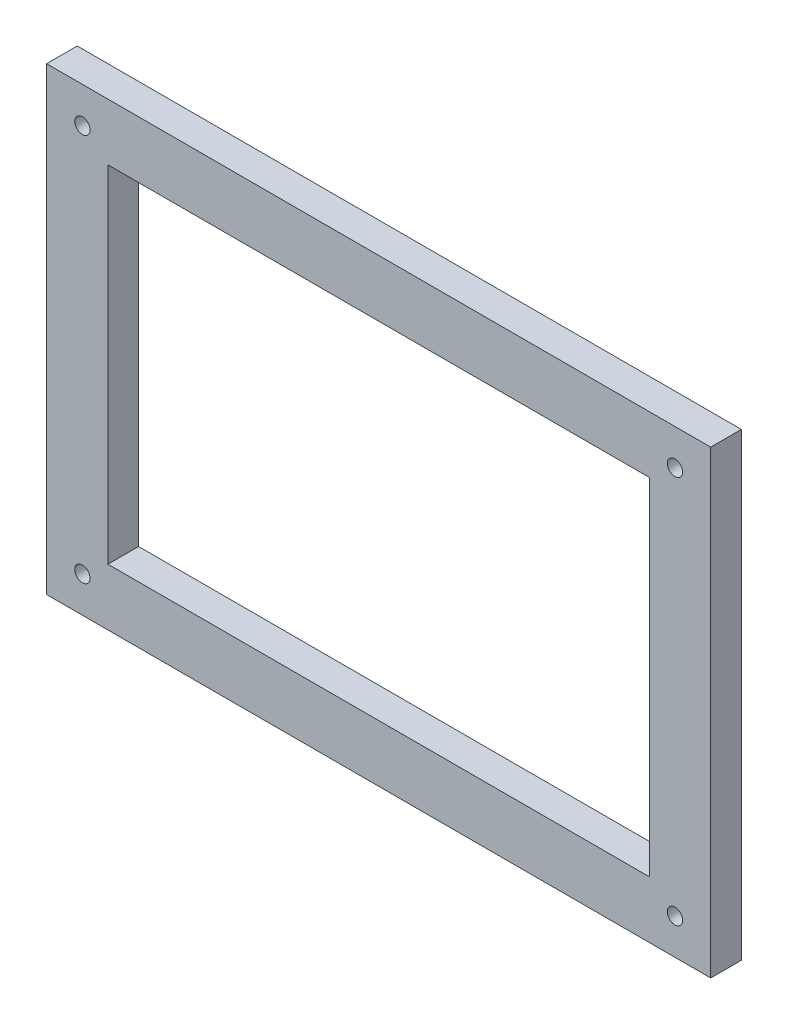
ISO-10303-21;
HEADER;
FILE_DESCRIPTION(('STEP AP214'),'2;1');
FILE_NAME('part.step','',(''),(''),'','','');
FILE_SCHEMA(('AUTOMOTIVE_DESIGN { 1 0 10303 214 1 1 1 1 }'));
ENDSEC;
DATA;
#1=APPLICATION_CONTEXT('core data for automotive mechanical design processes');
#2=APPLICATION_PROTOCOL_DEFINITION('international standard','automotive_design',2000,#1);
#3=PRODUCT_CONTEXT('',#1,'mechanical');
#4=PRODUCT('Part','Part','',(#3));
#5=PRODUCT_RELATED_PRODUCT_CATEGORY('part','',(#4));
#6=PRODUCT_DEFINITION_FORMATION('','',#4);
#7=PRODUCT_DEFINITION_CONTEXT('part definition',#1,'design');
#8=PRODUCT_DEFINITION('design','',#6,#7);
#9=PRODUCT_DEFINITION_SHAPE('','',#8);
#10=(LENGTH_UNIT() NAMED_UNIT(*) SI_UNIT(.MILLI.,.METRE.));
#11=(NAMED_UNIT(*) PLANE_ANGLE_UNIT() SI_UNIT($,.RADIAN.));
#12=(NAMED_UNIT(*) SI_UNIT($,.STERADIAN.) SOLID_ANGLE_UNIT());
#13=UNCERTAINTY_MEASURE_WITH_UNIT(LENGTH_MEASURE(1.E-05),#10,'distance_accuracy_value','');
#14=(GEOMETRIC_REPRESENTATION_CONTEXT(3) GLOBAL_UNCERTAINTY_ASSIGNED_CONTEXT((#13)) GLOBAL_UNIT_ASSIGNED_CONTEXT((#10,
#11,#12)) REPRESENTATION_CONTEXT('',''));
#15=CARTESIAN_POINT('',(0.,0.,0.));
#16=DIRECTION('',(0.,0.,1.));
#17=DIRECTION('',(1.,0.,0.));
#18=AXIS2_PLACEMENT_3D('',#15,#16,#17);
#19=CARTESIAN_POINT('',(0.,0.,6.));
#20=DIRECTION('',(0.,0.,-1.));
#21=DIRECTION('',(-1.,0.,0.));
#22=AXIS2_PLACEMENT_3D('',#19,#20,#21);
#23=PLANE('',#22);
#24=CARTESIAN_POINT('',(111.,71.85,6.));
#25=DIRECTION('',(0.,0.,1.));
#26=DIRECTION('',(1.,0.,0.));
#27=AXIS2_PLACEMENT_3D('',#24,#25,#26);
#28=CIRCLE('',#27,1.5);
#29=CARTESIAN_POINT('',(112.5,71.85,6.));
#30=VERTEX_POINT('',#29);
#31=EDGE_CURVE('E237',#30,#30,#28,.T.);
#32=ORIENTED_EDGE('',*,*,#31,.F.);
#33=EDGE_LOOP('',(#32));
#34=FACE_BOUND('',#33,.T.);
#35=CARTESIAN_POINT('',(-5.,-4.15000000000001,6.));
#36=DIRECTION('',(0.,0.,1.));
#37=DIRECTION('',(1.,0.,0.));
#38=AXIS2_PLACEMENT_3D('',#35,#36,#37);
#39=CIRCLE('',#38,1.5);
#40=CARTESIAN_POINT('',(-3.5,-4.15000000000001,6.));
#41=VERTEX_POINT('',#40);
#42=EDGE_CURVE('E250',#41,#41,#39,.T.);
#43=ORIENTED_EDGE('',*,*,#42,.F.);
#44=EDGE_LOOP('',(#43));
#45=FACE_BOUND('',#44,.T.);
#46=CARTESIAN_POINT('',(-5.,71.85,6.));
#47=DIRECTION('',(0.,0.,1.));
#48=DIRECTION('',(1.,0.,0.));
#49=AXIS2_PLACEMENT_3D('',#46,#47,#48);
#50=CIRCLE('',#49,1.5);
#51=CARTESIAN_POINT('',(-3.5,71.85,6.));
#52=VERTEX_POINT('',#51);
#53=EDGE_CURVE('E256',#52,#52,#50,.T.);
#54=ORIENTED_EDGE('',*,*,#53,.F.);
#55=EDGE_LOOP('',(#54));
#56=FACE_BOUND('',#55,.T.);
#57=DIRECTION('',(0.,-1.,0.));
#58=VECTOR('',#57,1.);
#59=CARTESIAN_POINT('',(-12.,-11.15,6.));
#60=LINE('',#59,#58);
#61=CARTESIAN_POINT('',(-12.,78.85,6.));
#62=VERTEX_POINT('',#61);
#63=CARTESIAN_POINT('',(-12.,-11.15,6.));
#64=VERTEX_POINT('',#63);
#65=EDGE_CURVE('E137',#62,#64,#60,.T.);
#66=ORIENTED_EDGE('',*,*,#65,.T.);
#67=DIRECTION('',(1.,0.,0.));
#68=VECTOR('',#67,1.);
#69=CARTESIAN_POINT('',(-12.,-11.15,6.));
#70=LINE('',#69,#68);
#71=CARTESIAN_POINT('',(118.,-11.15,6.));
#72=VERTEX_POINT('',#71);
#73=EDGE_CURVE('E140',#64,#72,#70,.T.);
#74=ORIENTED_EDGE('',*,*,#73,.T.);
#75=DIRECTION('',(0.,1.,0.));
#76=VECTOR('',#75,1.);
#77=CARTESIAN_POINT('',(118.,-11.15,6.));
#78=LINE('',#77,#76);
#79=CARTESIAN_POINT('',(118.,78.85,6.));
#80=VERTEX_POINT('',#79);
#81=EDGE_CURVE('E143',#72,#80,#78,.T.);
#82=ORIENTED_EDGE('',*,*,#81,.T.);
#83=DIRECTION('',(-1.,0.,0.));
#84=VECTOR('',#83,1.);
#85=CARTESIAN_POINT('',(-12.,78.85,6.));
#86=LINE('',#85,#84);
#87=EDGE_CURVE('E145',#80,#62,#86,.T.);
#88=ORIENTED_EDGE('',*,*,#87,.T.);
#89=EDGE_LOOP('',(#66,#74,#82,#88));
#90=FACE_BOUND('',#89,.T.);
#91=DIRECTION('',(0.,-1.,0.));
#92=VECTOR('',#91,1.);
#93=CARTESIAN_POINT('',(0.,0.,6.));
#94=LINE('',#93,#92);
#95=CARTESIAN_POINT('',(0.,67.7,6.));
#96=VERTEX_POINT('',#95);
#97=CARTESIAN_POINT('',(0.,0.,6.));
#98=VERTEX_POINT('',#97);
#99=EDGE_CURVE('E98',#96,#98,#94,.T.);
#100=ORIENTED_EDGE('',*,*,#99,.F.);
#101=DIRECTION('',(-1.,0.,0.));
#102=VECTOR('',#101,1.);
#103=CARTESIAN_POINT('',(0.,67.7,6.));
#104=LINE('',#103,#102);
#105=CARTESIAN_POINT('',(106.,67.7,6.));
#106=VERTEX_POINT('',#105);
#107=EDGE_CURVE('E121',#106,#96,#104,.T.);
#108=ORIENTED_EDGE('',*,*,#107,.F.);
#109=DIRECTION('',(0.,1.,0.));
#110=VECTOR('',#109,1.);
#111=CARTESIAN_POINT('',(106.,0.,6.));
#112=LINE('',#111,#110);
#113=CARTESIAN_POINT('',(106.,0.,6.));
#114=VERTEX_POINT('',#113);
#115=EDGE_CURVE('E119',#114,#106,#112,.T.);
#116=ORIENTED_EDGE('',*,*,#115,.F.);
#117=DIRECTION('',(1.,0.,0.));
#118=VECTOR('',#117,1.);
#119=CARTESIAN_POINT('',(0.,0.,6.));
#120=LINE('',#119,#118);
#121=EDGE_CURVE('E106',#98,#114,#120,.T.);
#122=ORIENTED_EDGE('',*,*,#121,.F.);
#123=EDGE_LOOP('',(#100,#108,#116,#122));
#124=FACE_BOUND('',#123,.T.);
#125=CARTESIAN_POINT('',(111.,-4.15000000000001,6.));
#126=DIRECTION('',(0.,0.,1.));
#127=DIRECTION('',(1.,0.,0.));
#128=AXIS2_PLACEMENT_3D('',#125,#126,#127);
#129=CIRCLE('',#128,1.5);
#130=CARTESIAN_POINT('',(112.5,-4.15000000000001,6.));
#131=VERTEX_POINT('',#130);
#132=EDGE_CURVE('E241',#131,#131,#129,.T.);
#133=ORIENTED_EDGE('',*,*,#132,.F.);
#134=EDGE_LOOP('',(#133));
#135=FACE_BOUND('',#134,.T.);
#136=ADVANCED_FACE('F33',(#34,#45,#56,#90,#124,#135),#23,.F.);
#137=CARTESIAN_POINT('',(0.,0.,0.));
#138=DIRECTION('',(0.,0.,-1.));
#139=DIRECTION('',(-1.,0.,0.));
#140=AXIS2_PLACEMENT_3D('',#137,#138,#139);
#141=PLANE('',#140);
#142=CARTESIAN_POINT('',(111.,71.85,0.));
#143=DIRECTION('',(0.,0.,-1.));
#144=DIRECTION('',(-1.,0.,0.));
#145=AXIS2_PLACEMENT_3D('',#142,#143,#144);
#146=CIRCLE('',#145,1.5);
#147=CARTESIAN_POINT('',(109.5,71.85,0.));
#148=VERTEX_POINT('',#147);
#149=EDGE_CURVE('E240',#148,#148,#146,.T.);
#150=ORIENTED_EDGE('',*,*,#149,.F.);
#151=EDGE_LOOP('',(#150));
#152=FACE_BOUND('',#151,.T.);
#153=CARTESIAN_POINT('',(111.,-4.15000000000001,0.));
#154=DIRECTION('',(0.,0.,-1.));
#155=DIRECTION('',(-1.,0.,0.));
#156=AXIS2_PLACEMENT_3D('',#153,#154,#155);
#157=CIRCLE('',#156,1.5);
#158=CARTESIAN_POINT('',(109.5,-4.15000000000001,0.));
#159=VERTEX_POINT('',#158);
#160=EDGE_CURVE('E244',#159,#159,#157,.T.);
#161=ORIENTED_EDGE('',*,*,#160,.F.);
#162=EDGE_LOOP('',(#161));
#163=FACE_BOUND('',#162,.T.);
#164=CARTESIAN_POINT('',(-5.,-4.15000000000001,0.));
#165=DIRECTION('',(0.,0.,-1.));
#166=DIRECTION('',(-1.,0.,0.));
#167=AXIS2_PLACEMENT_3D('',#164,#165,#166);
#168=CIRCLE('',#167,1.5);
#169=CARTESIAN_POINT('',(-6.5,-4.15000000000001,0.));
#170=VERTEX_POINT('',#169);
#171=EDGE_CURVE('E253',#170,#170,#168,.T.);
#172=ORIENTED_EDGE('',*,*,#171,.F.);
#173=EDGE_LOOP('',(#172));
#174=FACE_BOUND('',#173,.T.);
#175=CARTESIAN_POINT('',(-5.,71.85,0.));
#176=DIRECTION('',(0.,0.,-1.));
#177=DIRECTION('',(-1.,0.,0.));
#178=AXIS2_PLACEMENT_3D('',#175,#176,#177);
#179=CIRCLE('',#178,1.5);
#180=CARTESIAN_POINT('',(-6.5,71.85,0.));
#181=VERTEX_POINT('',#180);
#182=EDGE_CURVE('E127',#181,#181,#179,.T.);
#183=ORIENTED_EDGE('',*,*,#182,.F.);
#184=EDGE_LOOP('',(#183));
#185=FACE_BOUND('',#184,.T.);
#186=DIRECTION('',(0.,-1.,0.));
#187=VECTOR('',#186,1.);
#188=CARTESIAN_POINT('',(-12.,-11.15,0.));
#189=LINE('',#188,#187);
#190=CARTESIAN_POINT('',(-12.,78.85,0.));
#191=VERTEX_POINT('',#190);
#192=CARTESIAN_POINT('',(-12.,-11.15,0.));
#193=VERTEX_POINT('',#192);
#194=EDGE_CURVE('E114',#191,#193,#189,.T.);
#195=ORIENTED_EDGE('',*,*,#194,.F.);
#196=DIRECTION('',(-1.,0.,0.));
#197=VECTOR('',#196,1.);
#198=CARTESIAN_POINT('',(-12.,78.85,0.));
#199=LINE('',#198,#197);
#200=CARTESIAN_POINT('',(118.,78.85,0.));
#201=VERTEX_POINT('',#200);
#202=EDGE_CURVE('E141',#201,#191,#199,.T.);
#203=ORIENTED_EDGE('',*,*,#202,.F.);
#204=DIRECTION('',(0.,1.,0.));
#205=VECTOR('',#204,1.);
#206=CARTESIAN_POINT('',(118.,-11.15,0.));
#207=LINE('',#206,#205);
#208=CARTESIAN_POINT('',(118.,-11.15,0.));
#209=VERTEX_POINT('',#208);
#210=EDGE_CURVE('E152',#209,#201,#207,.T.);
#211=ORIENTED_EDGE('',*,*,#210,.F.);
#212=DIRECTION('',(1.,0.,0.));
#213=VECTOR('',#212,1.);
#214=CARTESIAN_POINT('',(-12.,-11.15,0.));
#215=LINE('',#214,#213);
#216=EDGE_CURVE('E150',#193,#209,#215,.T.);
#217=ORIENTED_EDGE('',*,*,#216,.F.);
#218=EDGE_LOOP('',(#195,#203,#211,#217));
#219=FACE_BOUND('',#218,.T.);
#220=DIRECTION('',(-1.,0.,0.));
#221=VECTOR('',#220,1.);
#222=CARTESIAN_POINT('',(0.,67.7,0.));
#223=LINE('',#222,#221);
#224=CARTESIAN_POINT('',(106.,67.7,0.));
#225=VERTEX_POINT('',#224);
#226=CARTESIAN_POINT('',(0.,67.7,0.));
#227=VERTEX_POINT('',#226);
#228=EDGE_CURVE('E107',#225,#227,#223,.T.);
#229=ORIENTED_EDGE('',*,*,#228,.T.);
#230=DIRECTION('',(0.,-1.,0.));
#231=VECTOR('',#230,1.);
#232=CARTESIAN_POINT('',(0.,0.,0.));
#233=LINE('',#232,#231);
#234=CARTESIAN_POINT('',(0.,0.,0.));
#235=VERTEX_POINT('',#234);
#236=EDGE_CURVE('E56',#227,#235,#233,.T.);
#237=ORIENTED_EDGE('',*,*,#236,.T.);
#238=DIRECTION('',(1.,0.,0.));
#239=VECTOR('',#238,1.);
#240=CARTESIAN_POINT('',(0.,0.,0.));
#241=LINE('',#240,#239);
#242=CARTESIAN_POINT('',(106.,0.,0.));
#243=VERTEX_POINT('',#242);
#244=EDGE_CURVE('E113',#235,#243,#241,.T.);
#245=ORIENTED_EDGE('',*,*,#244,.T.);
#246=DIRECTION('',(0.,1.,0.));
#247=VECTOR('',#246,1.);
#248=CARTESIAN_POINT('',(106.,0.,0.));
#249=LINE('',#248,#247);
#250=EDGE_CURVE('E129',#243,#225,#249,.T.);
#251=ORIENTED_EDGE('',*,*,#250,.T.);
#252=EDGE_LOOP('',(#229,#237,#245,#251));
#253=FACE_BOUND('',#252,.T.);
#254=ADVANCED_FACE('F170',(#152,#163,#174,#185,#219,#253),#141,.T.);
#255=CARTESIAN_POINT('',(-12.,-11.15,6.));
#256=DIRECTION('',(1.,0.,0.));
#257=DIRECTION('',(0.,0.,-1.));
#258=AXIS2_PLACEMENT_3D('',#255,#256,#257);
#259=PLANE('',#258);
#260=ORIENTED_EDGE('',*,*,#194,.T.);
#261=DIRECTION('',(0.,0.,-1.));
#262=VECTOR('',#261,1.);
#263=CARTESIAN_POINT('',(-12.,-11.15,6.));
#264=LINE('',#263,#262);
#265=EDGE_CURVE('E11',#64,#193,#264,.T.);
#266=ORIENTED_EDGE('',*,*,#265,.F.);
#267=ORIENTED_EDGE('',*,*,#65,.F.);
#268=DIRECTION('',(0.,0.,-1.));
#269=VECTOR('',#268,1.);
#270=CARTESIAN_POINT('',(-12.,78.85,6.));
#271=LINE('',#270,#269);
#272=EDGE_CURVE('E147',#62,#191,#271,.T.);
#273=ORIENTED_EDGE('',*,*,#272,.T.);
#274=EDGE_LOOP('',(#260,#266,#267,#273));
#275=FACE_BOUND('',#274,.T.);
#276=ADVANCED_FACE('F35',(#275),#259,.F.);
#277=CARTESIAN_POINT('',(-12.,-11.15,6.));
#278=DIRECTION('',(0.,1.,0.));
#279=DIRECTION('',(0.,0.,1.));
#280=AXIS2_PLACEMENT_3D('',#277,#278,#279);
#281=PLANE('',#280);
#282=ORIENTED_EDGE('',*,*,#216,.T.);
#283=DIRECTION('',(0.,0.,-1.));
#284=VECTOR('',#283,1.);
#285=CARTESIAN_POINT('',(118.,-11.15,6.));
#286=LINE('',#285,#284);
#287=EDGE_CURVE('E41',#72,#209,#286,.T.);
#288=ORIENTED_EDGE('',*,*,#287,.F.);
#289=ORIENTED_EDGE('',*,*,#73,.F.);
#290=ORIENTED_EDGE('',*,*,#265,.T.);
#291=EDGE_LOOP('',(#282,#288,#289,#290));
#292=FACE_BOUND('',#291,.T.);
#293=ADVANCED_FACE('F180',(#292),#281,.F.);
#294=CARTESIAN_POINT('',(118.,-11.15,6.));
#295=DIRECTION('',(-1.,0.,0.));
#296=DIRECTION('',(0.,0.,1.));
#297=AXIS2_PLACEMENT_3D('',#294,#295,#296);
#298=PLANE('',#297);
#299=ORIENTED_EDGE('',*,*,#210,.T.);
#300=DIRECTION('',(0.,0.,-1.));
#301=VECTOR('',#300,1.);
#302=CARTESIAN_POINT('',(118.,78.85,6.));
#303=LINE('',#302,#301);
#304=EDGE_CURVE('E157',#80,#201,#303,.T.);
#305=ORIENTED_EDGE('',*,*,#304,.F.);
#306=ORIENTED_EDGE('',*,*,#81,.F.);
#307=ORIENTED_EDGE('',*,*,#287,.T.);
#308=EDGE_LOOP('',(#299,#305,#306,#307));
#309=FACE_BOUND('',#308,.T.);
#310=ADVANCED_FACE('F164',(#309),#298,.F.);
#311=CARTESIAN_POINT('',(-12.,78.85,6.));
#312=DIRECTION('',(0.,-1.,0.));
#313=DIRECTION('',(0.,0.,-1.));
#314=AXIS2_PLACEMENT_3D('',#311,#312,#313);
#315=PLANE('',#314);
#316=ORIENTED_EDGE('',*,*,#202,.T.);
#317=ORIENTED_EDGE('',*,*,#272,.F.);
#318=ORIENTED_EDGE('',*,*,#87,.F.);
#319=ORIENTED_EDGE('',*,*,#304,.T.);
#320=EDGE_LOOP('',(#316,#317,#318,#319));
#321=FACE_BOUND('',#320,.T.);
#322=ADVANCED_FACE('F174',(#321),#315,.F.);
#323=CARTESIAN_POINT('',(0.,0.,6.));
#324=DIRECTION('',(1.,0.,0.));
#325=DIRECTION('',(0.,0.,-1.));
#326=AXIS2_PLACEMENT_3D('',#323,#324,#325);
#327=PLANE('',#326);
#328=ORIENTED_EDGE('',*,*,#236,.F.);
#329=DIRECTION('',(0.,0.,-1.));
#330=VECTOR('',#329,1.);
#331=CARTESIAN_POINT('',(0.,67.7,6.));
#332=LINE('',#331,#330);
#333=EDGE_CURVE('E102',#96,#227,#332,.T.);
#334=ORIENTED_EDGE('',*,*,#333,.F.);
#335=ORIENTED_EDGE('',*,*,#99,.T.);
#336=DIRECTION('',(0.,0.,-1.));
#337=VECTOR('',#336,1.);
#338=CARTESIAN_POINT('',(0.,0.,6.));
#339=LINE('',#338,#337);
#340=EDGE_CURVE('E101',#98,#235,#339,.T.);
#341=ORIENTED_EDGE('',*,*,#340,.T.);
#342=EDGE_LOOP('',(#328,#334,#335,#341));
#343=FACE_BOUND('',#342,.T.);
#344=ADVANCED_FACE('F100',(#343),#327,.T.);
#345=CARTESIAN_POINT('',(0.,0.,6.));
#346=DIRECTION('',(0.,1.,0.));
#347=DIRECTION('',(0.,0.,1.));
#348=AXIS2_PLACEMENT_3D('',#345,#346,#347);
#349=PLANE('',#348);
#350=ORIENTED_EDGE('',*,*,#244,.F.);
#351=ORIENTED_EDGE('',*,*,#340,.F.);
#352=ORIENTED_EDGE('',*,*,#121,.T.);
#353=DIRECTION('',(0.,0.,-1.));
#354=VECTOR('',#353,1.);
#355=CARTESIAN_POINT('',(106.,0.,6.));
#356=LINE('',#355,#354);
#357=EDGE_CURVE('E115',#114,#243,#356,.T.);
#358=ORIENTED_EDGE('',*,*,#357,.T.);
#359=EDGE_LOOP('',(#350,#351,#352,#358));
#360=FACE_BOUND('',#359,.T.);
#361=ADVANCED_FACE('F110',(#360),#349,.T.);
#362=CARTESIAN_POINT('',(106.,0.,6.));
#363=DIRECTION('',(-1.,0.,0.));
#364=DIRECTION('',(0.,0.,1.));
#365=AXIS2_PLACEMENT_3D('',#362,#363,#364);
#366=PLANE('',#365);
#367=ORIENTED_EDGE('',*,*,#250,.F.);
#368=ORIENTED_EDGE('',*,*,#357,.F.);
#369=ORIENTED_EDGE('',*,*,#115,.T.);
#370=DIRECTION('',(0.,0.,-1.));
#371=VECTOR('',#370,1.);
#372=CARTESIAN_POINT('',(106.,67.7,6.));
#373=LINE('',#372,#371);
#374=EDGE_CURVE('E48',#106,#225,#373,.T.);
#375=ORIENTED_EDGE('',*,*,#374,.T.);
#376=EDGE_LOOP('',(#367,#368,#369,#375));
#377=FACE_BOUND('',#376,.T.);
#378=ADVANCED_FACE('F208',(#377),#366,.T.);
#379=CARTESIAN_POINT('',(0.,67.7,6.));
#380=DIRECTION('',(0.,-1.,0.));
#381=DIRECTION('',(0.,0.,-1.));
#382=AXIS2_PLACEMENT_3D('',#379,#380,#381);
#383=PLANE('',#382);
#384=ORIENTED_EDGE('',*,*,#228,.F.);
#385=ORIENTED_EDGE('',*,*,#374,.F.);
#386=ORIENTED_EDGE('',*,*,#107,.T.);
#387=ORIENTED_EDGE('',*,*,#333,.T.);
#388=EDGE_LOOP('',(#384,#385,#386,#387));
#389=FACE_BOUND('',#388,.T.);
#390=ADVANCED_FACE('F212',(#389),#383,.T.);
#391=CARTESIAN_POINT('',(-5.,71.85,6.));
#392=DIRECTION('',(0.,0.,1.));
#393=DIRECTION('',(1.,0.,0.));
#394=AXIS2_PLACEMENT_3D('',#391,#392,#393);
#395=CYLINDRICAL_SURFACE('',#394,1.5);
#396=ORIENTED_EDGE('',*,*,#53,.T.);
#397=EDGE_LOOP('',(#396));
#398=FACE_BOUND('',#397,.T.);
#399=ORIENTED_EDGE('',*,*,#182,.T.);
#400=EDGE_LOOP('',(#399));
#401=FACE_BOUND('',#400,.T.);
#402=ADVANCED_FACE('F218',(#398,#401),#395,.F.);
#403=CARTESIAN_POINT('',(-5.,-4.15000000000001,6.));
#404=DIRECTION('',(0.,0.,1.));
#405=DIRECTION('',(1.,0.,0.));
#406=AXIS2_PLACEMENT_3D('',#403,#404,#405);
#407=CYLINDRICAL_SURFACE('',#406,1.5);
#408=ORIENTED_EDGE('',*,*,#42,.T.);
#409=EDGE_LOOP('',(#408));
#410=FACE_BOUND('',#409,.T.);
#411=ORIENTED_EDGE('',*,*,#171,.T.);
#412=EDGE_LOOP('',(#411));
#413=FACE_BOUND('',#412,.T.);
#414=ADVANCED_FACE('F221',(#410,#413),#407,.F.);
#415=CARTESIAN_POINT('',(111.,-4.15000000000001,6.));
#416=DIRECTION('',(0.,0.,1.));
#417=DIRECTION('',(1.,0.,0.));
#418=AXIS2_PLACEMENT_3D('',#415,#416,#417);
#419=CYLINDRICAL_SURFACE('',#418,1.5);
#420=ORIENTED_EDGE('',*,*,#132,.T.);
#421=EDGE_LOOP('',(#420));
#422=FACE_BOUND('',#421,.T.);
#423=ORIENTED_EDGE('',*,*,#160,.T.);
#424=EDGE_LOOP('',(#423));
#425=FACE_BOUND('',#424,.T.);
#426=ADVANCED_FACE('F225',(#422,#425),#419,.F.);
#427=CARTESIAN_POINT('',(111.,71.85,6.));
#428=DIRECTION('',(0.,0.,1.));
#429=DIRECTION('',(1.,0.,0.));
#430=AXIS2_PLACEMENT_3D('',#427,#428,#429);
#431=CYLINDRICAL_SURFACE('',#430,1.5);
#432=ORIENTED_EDGE('',*,*,#31,.T.);
#433=EDGE_LOOP('',(#432));
#434=FACE_BOUND('',#433,.T.);
#435=ORIENTED_EDGE('',*,*,#149,.T.);
#436=EDGE_LOOP('',(#435));
#437=FACE_BOUND('',#436,.T.);
#438=ADVANCED_FACE('F229',(#434,#437),#431,.F.);
#439=CLOSED_SHELL('',(#136,#254,#276,#293,#310,#322,#344,#361,#378,#390,#402,#414,#426,#438));
#440=MANIFOLD_SOLID_BREP('B2',#439);
#441=ADVANCED_BREP_SHAPE_REPRESENTATION('',(#18,#440),#14);
#442=SHAPE_DEFINITION_REPRESENTATION(#9,#441);
ENDSEC;
END-ISO-10303-21;
